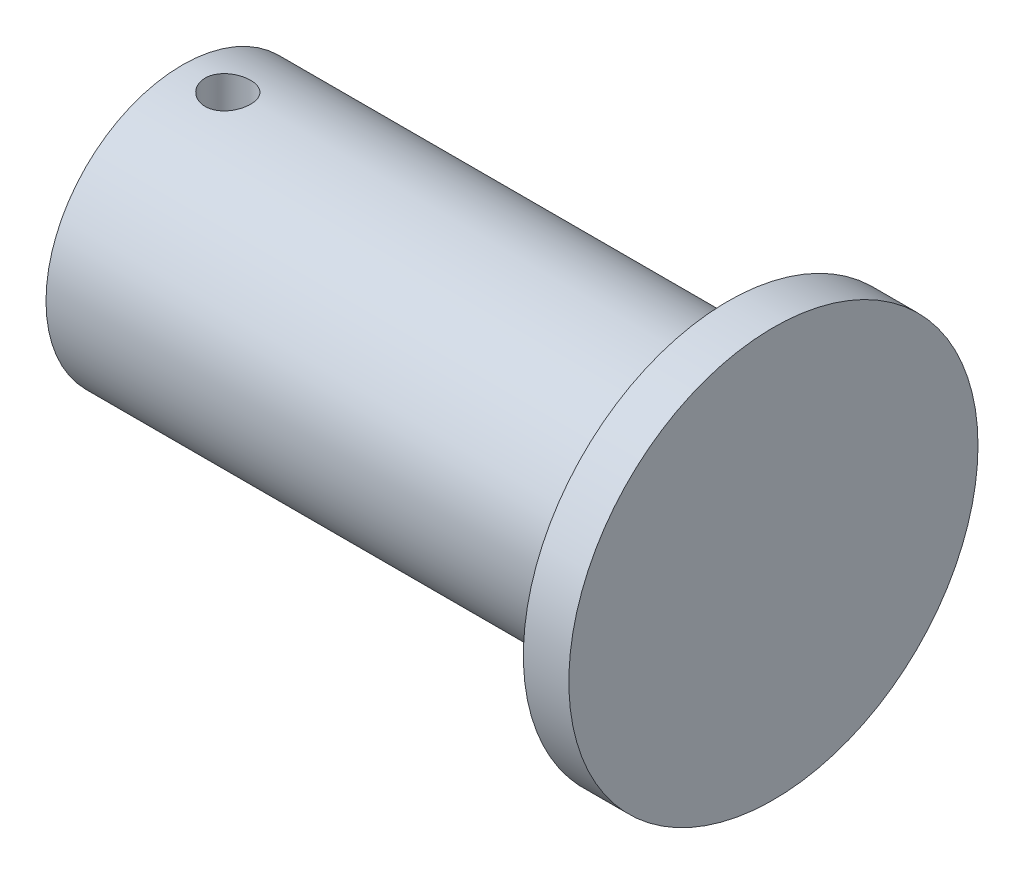
ISO-10303-21;
HEADER;
FILE_DESCRIPTION(('STEP AP214'),'2;1');
FILE_NAME('part.step','',(''),(''),'','','');
FILE_SCHEMA(('AUTOMOTIVE_DESIGN { 1 0 10303 214 1 1 1 1 }'));
ENDSEC;
DATA;
#1=APPLICATION_CONTEXT('core data for automotive mechanical design processes');
#2=APPLICATION_PROTOCOL_DEFINITION('international standard','automotive_design',2000,#1);
#3=PRODUCT_CONTEXT('',#1,'mechanical');
#4=PRODUCT('Part','Part','',(#3));
#5=PRODUCT_RELATED_PRODUCT_CATEGORY('part','',(#4));
#6=PRODUCT_DEFINITION_FORMATION('','',#4);
#7=PRODUCT_DEFINITION_CONTEXT('part definition',#1,'design');
#8=PRODUCT_DEFINITION('design','',#6,#7);
#9=PRODUCT_DEFINITION_SHAPE('','',#8);
#10=(LENGTH_UNIT() NAMED_UNIT(*) SI_UNIT(.MILLI.,.METRE.));
#11=(NAMED_UNIT(*) PLANE_ANGLE_UNIT() SI_UNIT($,.RADIAN.));
#12=(NAMED_UNIT(*) SI_UNIT($,.STERADIAN.) SOLID_ANGLE_UNIT());
#13=UNCERTAINTY_MEASURE_WITH_UNIT(LENGTH_MEASURE(1.E-05),#10,'distance_accuracy_value','');
#14=(GEOMETRIC_REPRESENTATION_CONTEXT(3) GLOBAL_UNCERTAINTY_ASSIGNED_CONTEXT((#13)) GLOBAL_UNIT_ASSIGNED_CONTEXT((#10,
#11,#12)) REPRESENTATION_CONTEXT('',''));
#15=CARTESIAN_POINT('',(0.,0.,0.));
#16=DIRECTION('',(0.,0.,1.));
#17=DIRECTION('',(1.,0.,0.));
#18=AXIS2_PLACEMENT_3D('',#15,#16,#17);
#19=CARTESIAN_POINT('',(30.,0.,0.));
#20=DIRECTION('',(-1.,0.,0.));
#21=DIRECTION('',(0.,0.,1.));
#22=AXIS2_PLACEMENT_3D('',#19,#20,#21);
#23=CYLINDRICAL_SURFACE('',#22,15.);
#24=CARTESIAN_POINT('',(-25.,-14.790199457749,2.5));
#25=CARTESIAN_POINT('',(-24.8606242518382,-14.790201973666,2.49999439841982));
#26=CARTESIAN_POINT('',(-24.7211723939285,-14.7921909238524,2.48830516902828));
#27=CARTESIAN_POINT('',(-24.4461814567368,-14.7999245720004,2.44187742806637));
#28=CARTESIAN_POINT('',(-24.3106461062419,-14.8056727334637,2.40711766030861));
#29=CARTESIAN_POINT('',(-24.0475077166584,-14.8202560936731,2.31562954367049));
#30=CARTESIAN_POINT('',(-23.9198981513378,-14.8290887118401,2.25891955493198));
#31=CARTESIAN_POINT('',(-23.6760190452822,-14.8488427210228,2.12518649688947));
#32=CARTESIAN_POINT('',(-23.5597482304227,-14.8597638769423,2.04816571350133));
#33=CARTESIAN_POINT('',(-23.3406871502554,-14.8825847115588,1.87518752696654));
#34=CARTESIAN_POINT('',(-23.2380248686138,-14.8944921732795,1.77906904893234));
#35=CARTESIAN_POINT('',(-23.0502066931382,-14.9178748066858,1.57097200469527));
#36=CARTESIAN_POINT('',(-22.9650518368846,-14.9293499527174,1.45899249914997));
#37=CARTESIAN_POINT('',(-22.8141854327807,-14.9506573698271,1.22152286994835));
#38=CARTESIAN_POINT('',(-22.7485929922682,-14.9604794243234,1.09595608145671));
#39=CARTESIAN_POINT('',(-22.6394789294694,-14.9772873695709,0.835395621723866));
#40=CARTESIAN_POINT('',(-22.5959558721151,-14.9842734447266,0.700402564078186));
#41=CARTESIAN_POINT('',(-22.5326074650161,-14.994567347244,0.42614372634424));
#42=CARTESIAN_POINT('',(-22.5125670839953,-14.9979085311091,0.286928886679269));
#43=CARTESIAN_POINT('',(-22.4960842458474,-15.0006507934278,0.0070752855257956));
#44=CARTESIAN_POINT('',(-22.4996401847528,-15.0000521396931,-0.1335633785289));
#45=CARTESIAN_POINT('',(-22.5300813515282,-14.9950085843139,-0.410802185078877));
#46=CARTESIAN_POINT('',(-22.5567351634092,-14.990601836924,-0.547428530700142));
#47=CARTESIAN_POINT('',(-22.6322510742465,-14.9784797877164,-0.814241979611792));
#48=CARTESIAN_POINT('',(-22.6811138495895,-14.9707643851321,-0.944428886651504));
#49=CARTESIAN_POINT('',(-22.7998906403153,-14.9528269851196,-1.19535614778265));
#50=CARTESIAN_POINT('',(-22.8699000120824,-14.9425936732688,-1.31605052301904));
#51=CARTESIAN_POINT('',(-23.028912822635,-14.920757380715,-1.54406552984664));
#52=CARTESIAN_POINT('',(-23.1179177987108,-14.9091542891913,-1.65138507791588));
#53=CARTESIAN_POINT('',(-23.3136788066193,-14.885702682326,-1.85097127344667));
#54=CARTESIAN_POINT('',(-23.420637094901,-14.8738528973104,-1.94303950225321));
#55=CARTESIAN_POINT('',(-23.6485870902158,-14.8513795978481,-2.10795458844806));
#56=CARTESIAN_POINT('',(-23.7695789266828,-14.8407560947132,-2.18080126853242));
#57=CARTESIAN_POINT('',(-24.0223916418775,-14.8219375456182,-2.30524443448828));
#58=CARTESIAN_POINT('',(-24.1542244980921,-14.813745233026,-2.35681702727924));
#59=CARTESIAN_POINT('',(-24.4248490723075,-14.8007618868988,-2.43702987081562));
#60=CARTESIAN_POINT('',(-24.5636401764324,-14.7959705538832,-2.46567214076795));
#61=CARTESIAN_POINT('',(-24.8424661561621,-14.7903895942212,-2.49893188487927));
#62=CARTESIAN_POINT('',(-24.9824663797021,-14.7895528575867,-2.50383220791244));
#63=CARTESIAN_POINT('',(-25.2612866716908,-14.7918503478236,-2.49022270268246));
#64=CARTESIAN_POINT('',(-25.400106785514,-14.7949844213185,-2.47171377862466));
#65=CARTESIAN_POINT('',(-25.6717277591909,-14.8048268745502,-2.4120523349281));
#66=CARTESIAN_POINT('',(-25.804561139878,-14.8115125191835,-2.37104379064638));
#67=CARTESIAN_POINT('',(-26.0614701662795,-14.827685730055,-2.26769819019227));
#68=CARTESIAN_POINT('',(-26.1855452875509,-14.8371734639058,-2.20535985810093));
#69=CARTESIAN_POINT('',(-26.4226745944061,-14.8579912839739,-2.06045667322923));
#70=CARTESIAN_POINT('',(-26.5356165727561,-14.8693375560035,-1.97771056415936));
#71=CARTESIAN_POINT('',(-26.746113532695,-14.8925466667987,-1.79458946570798));
#72=CARTESIAN_POINT('',(-26.8436674311097,-14.9044095418533,-1.69421323638404));
#73=CARTESIAN_POINT('',(-27.0216518927287,-14.9274642211826,-1.47742807032881));
#74=CARTESIAN_POINT('',(-27.1018938262845,-14.9386477634467,-1.3608632533862));
#75=CARTESIAN_POINT('',(-27.2416553270049,-14.9589511243294,-1.11574344794933));
#76=CARTESIAN_POINT('',(-27.3011755644739,-14.9680710096998,-0.987188847470625));
#77=CARTESIAN_POINT('',(-27.3975105839549,-14.9831835816958,-0.722299051501326));
#78=CARTESIAN_POINT('',(-27.4344240757349,-14.9891898456762,-0.586000562602609));
#79=CARTESIAN_POINT('',(-27.4848155989638,-14.9974558316928,-0.309030734874209));
#80=CARTESIAN_POINT('',(-27.4982955587323,-14.9997158620019,-0.168359756821619));
#81=CARTESIAN_POINT('',(-27.5013818823122,-15.0002303788781,0.111541275773678));
#82=CARTESIAN_POINT('',(-27.4912752539411,-14.9985330202419,0.250768160602666));
#83=CARTESIAN_POINT('',(-27.4480960777306,-14.9914217838733,0.525511974314706));
#84=CARTESIAN_POINT('',(-27.4150236584903,-14.9860079269518,0.66102892396748));
#85=CARTESIAN_POINT('',(-27.3269618344563,-14.972069888274,0.924396445918538));
#86=CARTESIAN_POINT('',(-27.2719968317899,-14.9635491704088,1.05225537215382));
#87=CARTESIAN_POINT('',(-27.1417420637694,-14.9443275687803,1.29698045298217));
#88=CARTESIAN_POINT('',(-27.0664513349375,-14.9336265816741,1.41384608611822));
#89=CARTESIAN_POINT('',(-26.8966649075395,-14.9110762961641,1.63471294552639));
#90=CARTESIAN_POINT('',(-26.8019590452487,-14.8992152454112,1.73855143060274));
#91=CARTESIAN_POINT('',(-26.5964716920962,-14.8757630331437,1.92896387595091));
#92=CARTESIAN_POINT('',(-26.4856864410875,-14.8641719354951,2.0155337867119));
#93=CARTESIAN_POINT('',(-26.2502546775104,-14.8424834353391,2.16951427091086));
#94=CARTESIAN_POINT('',(-26.1255156602345,-14.8323971784578,2.2367849890577));
#95=CARTESIAN_POINT('',(-25.8663907641618,-14.8149921009131,2.34931453640427));
#96=CARTESIAN_POINT('',(-25.7320146773226,-14.8076705172488,2.39459535522307));
#97=CARTESIAN_POINT('',(-25.4975962305126,-14.7982474485649,2.45202605312742));
#98=CARTESIAN_POINT('',(-25.3989731920374,-14.7952462341947,2.46998741767139));
#99=CARTESIAN_POINT('',(-25.2002465151631,-14.7912213528807,2.49397629518131));
#100=CARTESIAN_POINT('',(-25.1001429036758,-14.7901976500369,2.50000402479277));
#101=CARTESIAN_POINT('',(-25.,-14.790199457749,2.5));
#102=B_SPLINE_CURVE_WITH_KNOTS('',3,(#24,#25,#26,#27,#28,#29,#30,#31,#32,#33,#34,#35,#36,#37,
#38,#39,#40,#41,#42,#43,#44,#45,#46,#47,#48,#49,#50,#51,#52,#53,#54,#55,#56,#57,#58,#59,#60,#61,
#62,#63,#64,#65,#66,#67,#68,#69,#70,#71,#72,#73,#74,#75,#76,#77,#78,#79,#80,#81,#82,#83,#84,#85,
#86,#87,#88,#89,#90,#91,#92,#93,#94,#95,#96,#97,#98,#99,#100,#101),.UNSPECIFIED.,.T.,.F.,(4,2,2,
2,2,2,2,2,2,2,2,2,2,2,2,2,2,2,2,2,2,2,2,2,2,2,2,2,2,2,2,2,2,2,2,2,2,2,4),(0.,0.417761038927743,
0.83590751996297,1.25370499787518,1.67145547405274,2.09289159155715,2.51435267834447,
2.93832980111435,3.36227935111113,3.78231567472565,4.20232344652692,4.61817121164668,
5.03403164249533,5.45179604139425,5.86959426226764,6.29246123462123,6.71533210746018,
7.13867662498603,7.56198385938076,7.9802354242041,8.39847083413976,8.81406064635491,
9.22967532293574,9.64912342762701,10.0686010443069,10.4924411303538,10.916267504767,
11.3382298441765,11.7601574591235,12.1769777626592,12.5937957321882,13.0101503983246,
13.4265248039233,13.8476699746325,14.2689137888181,14.6931372761832,15.1169356674445,
15.4171067054376,15.7172722940182),.UNSPECIFIED.);
#103=CARTESIAN_POINT('',(-25.,-14.790199457749,2.5));
#104=VERTEX_POINT('',#103);
#105=EDGE_CURVE('E35',#104,#104,#102,.T.);
#106=ORIENTED_EDGE('',*,*,#105,.T.);
#107=EDGE_LOOP('',(#106));
#108=FACE_BOUND('',#107,.T.);
#109=CARTESIAN_POINT('',(-25.,14.790199457749,2.5));
#110=CARTESIAN_POINT('',(-25.1393757481618,14.790201973666,2.49999439841982));
#111=CARTESIAN_POINT('',(-25.2788276060715,14.7921909238523,2.48830516902828));
#112=CARTESIAN_POINT('',(-25.5538185432632,14.7999245720004,2.44187742806637));
#113=CARTESIAN_POINT('',(-25.6893538937581,14.8056727334637,2.40711766030861));
#114=CARTESIAN_POINT('',(-25.9524922833416,14.8202560936731,2.31562954367049));
#115=CARTESIAN_POINT('',(-26.0801018486622,14.8290887118401,2.25891955493199));
#116=CARTESIAN_POINT('',(-26.3239809547178,14.8488427210228,2.12518649688947));
#117=CARTESIAN_POINT('',(-26.4402517695773,14.8597638769423,2.04816571350133));
#118=CARTESIAN_POINT('',(-26.6593128497446,14.8825847115588,1.87518752696654));
#119=CARTESIAN_POINT('',(-26.7619751313862,14.8944921732795,1.77906904893234));
#120=CARTESIAN_POINT('',(-26.9497933068618,14.9178748066858,1.57097200469527));
#121=CARTESIAN_POINT('',(-27.0349481631154,14.9293499527174,1.45899249914997));
#122=CARTESIAN_POINT('',(-27.1858145672193,14.9506573698271,1.22152286994836));
#123=CARTESIAN_POINT('',(-27.2514070077318,14.9604794243234,1.09595608145671));
#124=CARTESIAN_POINT('',(-27.3605210705305,14.9772873695709,0.835395621723868));
#125=CARTESIAN_POINT('',(-27.4040441278849,14.9842734447266,0.700402564078187));
#126=CARTESIAN_POINT('',(-27.4673925349839,14.994567347244,0.426143726344241));
#127=CARTESIAN_POINT('',(-27.4874329160047,14.9979085311091,0.28692888667927));
#128=CARTESIAN_POINT('',(-27.5039157541526,15.0006507934278,0.00707528552579642));
#129=CARTESIAN_POINT('',(-27.5003598152472,15.0000521396931,-0.133563378528899));
#130=CARTESIAN_POINT('',(-27.4699186484718,14.9950085843139,-0.410802185078876));
#131=CARTESIAN_POINT('',(-27.4432648365908,14.990601836924,-0.547428530700141));
#132=CARTESIAN_POINT('',(-27.3677489257535,14.9784797877164,-0.814241979611792));
#133=CARTESIAN_POINT('',(-27.3188861504105,14.9707643851321,-0.944428886651505));
#134=CARTESIAN_POINT('',(-27.2001093596847,14.9528269851196,-1.19535614778265));
#135=CARTESIAN_POINT('',(-27.1300999879176,14.9425936732688,-1.31605052301905));
#136=CARTESIAN_POINT('',(-26.9710871773649,14.920757380715,-1.54406552984664));
#137=CARTESIAN_POINT('',(-26.8820822012892,14.9091542891913,-1.65138507791588));
#138=CARTESIAN_POINT('',(-26.6863211933807,14.885702682326,-1.85097127344667));
#139=CARTESIAN_POINT('',(-26.579362905099,14.8738528973104,-1.94303950225321));
#140=CARTESIAN_POINT('',(-26.3514129097842,14.8513795978481,-2.10795458844806));
#141=CARTESIAN_POINT('',(-26.2304210733172,14.8407560947132,-2.18080126853242));
#142=CARTESIAN_POINT('',(-25.9776083581225,14.8219375456182,-2.30524443448829));
#143=CARTESIAN_POINT('',(-25.8457755019079,14.813745233026,-2.35681702727924));
#144=CARTESIAN_POINT('',(-25.5751509276924,14.8007618868988,-2.43702987081562));
#145=CARTESIAN_POINT('',(-25.4363598235676,14.7959705538832,-2.46567214076795));
#146=CARTESIAN_POINT('',(-25.1575338438379,14.7903895942212,-2.49893188487927));
#147=CARTESIAN_POINT('',(-25.0175336202979,14.7895528575867,-2.50383220791244));
#148=CARTESIAN_POINT('',(-24.7387133283092,14.7918503478236,-2.49022270268246));
#149=CARTESIAN_POINT('',(-24.599893214486,14.7949844213185,-2.47171377862466));
#150=CARTESIAN_POINT('',(-24.3282722408091,14.8048268745502,-2.4120523349281));
#151=CARTESIAN_POINT('',(-24.195438860122,14.8115125191835,-2.37104379064638));
#152=CARTESIAN_POINT('',(-23.9385298337205,14.827685730055,-2.26769819019228));
#153=CARTESIAN_POINT('',(-23.8144547124491,14.8371734639058,-2.20535985810093));
#154=CARTESIAN_POINT('',(-23.5773254055939,14.8579912839739,-2.06045667322923));
#155=CARTESIAN_POINT('',(-23.4643834272439,14.8693375560035,-1.97771056415936));
#156=CARTESIAN_POINT('',(-23.253886467305,14.8925466667987,-1.79458946570798));
#157=CARTESIAN_POINT('',(-23.1563325688903,14.9044095418533,-1.69421323638404));
#158=CARTESIAN_POINT('',(-22.9783481072713,14.9274642211826,-1.47742807032881));
#159=CARTESIAN_POINT('',(-22.8981061737155,14.9386477634467,-1.3608632533862));
#160=CARTESIAN_POINT('',(-22.7583446729951,14.9589511243294,-1.11574344794933));
#161=CARTESIAN_POINT('',(-22.6988244355261,14.9680710096998,-0.987188847470627));
#162=CARTESIAN_POINT('',(-22.6024894160451,14.9831835816958,-0.722299051501329));
#163=CARTESIAN_POINT('',(-22.5655759242651,14.9891898456762,-0.586000562602613));
#164=CARTESIAN_POINT('',(-22.5151844010362,14.9974558316928,-0.309030734874212));
#165=CARTESIAN_POINT('',(-22.5017044412676,14.9997158620019,-0.168359756821621));
#166=CARTESIAN_POINT('',(-22.4986181176878,15.0002303788781,0.111541275773676));
#167=CARTESIAN_POINT('',(-22.5087247460589,14.9985330202419,0.250768160602664));
#168=CARTESIAN_POINT('',(-22.5519039222694,14.9914217838733,0.525511974314705));
#169=CARTESIAN_POINT('',(-22.5849763415097,14.9860079269518,0.661028923967479));
#170=CARTESIAN_POINT('',(-22.6730381655436,14.972069888274,0.924396445918538));
#171=CARTESIAN_POINT('',(-22.72800316821,14.9635491704088,1.05225537215382));
#172=CARTESIAN_POINT('',(-22.8582579362306,14.9443275687803,1.29698045298217));
#173=CARTESIAN_POINT('',(-22.9335486650624,14.9336265816741,1.41384608611822));
#174=CARTESIAN_POINT('',(-23.1033350924605,14.9110762961641,1.6347129455264));
#175=CARTESIAN_POINT('',(-23.1980409547513,14.8992152454112,1.73855143060275));
#176=CARTESIAN_POINT('',(-23.4035283079038,14.8757630331437,1.92896387595091));
#177=CARTESIAN_POINT('',(-23.5143135589125,14.8641719354951,2.0155337867119));
#178=CARTESIAN_POINT('',(-23.7497453224896,14.8424834353391,2.16951427091086));
#179=CARTESIAN_POINT('',(-23.8744843397655,14.8323971784578,2.2367849890577));
#180=CARTESIAN_POINT('',(-24.1336092358381,14.8149921009131,2.34931453640427));
#181=CARTESIAN_POINT('',(-24.2679853226774,14.8076705172488,2.39459535522307));
#182=CARTESIAN_POINT('',(-24.5024037694874,14.7982474485649,2.45202605312742));
#183=CARTESIAN_POINT('',(-24.6010268079626,14.7952462341947,2.46998741767139));
#184=CARTESIAN_POINT('',(-24.7997534848369,14.7912213528807,2.49397629518131));
#185=CARTESIAN_POINT('',(-24.8998570963242,14.7901976500369,2.50000402479277));
#186=CARTESIAN_POINT('',(-25.,14.790199457749,2.5));
#187=B_SPLINE_CURVE_WITH_KNOTS('',3,(#109,#110,#111,#112,#113,#114,#115,#116,#117,#118,#119,
#120,#121,#122,#123,#124,#125,#126,#127,#128,#129,#130,#131,#132,#133,#134,#135,#136,#137,#138,
#139,#140,#141,#142,#143,#144,#145,#146,#147,#148,#149,#150,#151,#152,#153,#154,#155,#156,#157,
#158,#159,#160,#161,#162,#163,#164,#165,#166,#167,#168,#169,#170,#171,#172,#173,#174,#175,#176,
#177,#178,#179,#180,#181,#182,#183,#184,#185,#186),.UNSPECIFIED.,.T.,.F.,(4,2,2,2,2,2,2,2,2,2,2,
2,2,2,2,2,2,2,2,2,2,2,2,2,2,2,2,2,2,2,2,2,2,2,2,2,2,2,4),(0.,0.417761038927747,0.83590751996297,
1.25370499787518,1.67145547405274,2.09289159155715,2.51435267834447,2.93832980111435,
3.36227935111113,3.78231567472565,4.20232344652692,4.61817121164668,5.03403164249533,
5.45179604139425,5.86959426226764,6.29246123462123,6.71533210746019,7.13867662498604,
7.56198385938077,7.98023542420411,8.39847083413976,8.81406064635491,9.22967532293574,
9.64912342762701,10.0686010443069,10.4924411303538,10.916267504767,11.3382298441765,
11.7601574591235,12.1769777626592,12.5937957321882,13.0101503983246,13.4265248039233,
13.8476699746325,14.2689137888181,14.6931372761832,15.1169356674445,15.4171067054376,
15.7172722940182),.UNSPECIFIED.);
#188=CARTESIAN_POINT('',(-25.,14.790199457749,2.5));
#189=VERTEX_POINT('',#188);
#190=EDGE_CURVE('E53',#189,#189,#187,.T.);
#191=ORIENTED_EDGE('',*,*,#190,.T.);
#192=EDGE_LOOP('',(#191));
#193=FACE_BOUND('',#192,.T.);
#194=CARTESIAN_POINT('',(30.,0.,0.));
#195=DIRECTION('',(1.,0.,0.));
#196=DIRECTION('',(0.,0.,-1.));
#197=AXIS2_PLACEMENT_3D('',#194,#195,#196);
#198=CIRCLE('',#197,15.);
#199=CARTESIAN_POINT('',(30.,0.,-15.));
#200=VERTEX_POINT('',#199);
#201=EDGE_CURVE('E10',#200,#200,#198,.T.);
#202=ORIENTED_EDGE('',*,*,#201,.F.);
#203=EDGE_LOOP('',(#202));
#204=FACE_BOUND('',#203,.T.);
#205=CARTESIAN_POINT('',(-30.,0.,0.));
#206=DIRECTION('',(1.,0.,0.));
#207=DIRECTION('',(0.,0.,-1.));
#208=AXIS2_PLACEMENT_3D('',#205,#206,#207);
#209=CIRCLE('',#208,15.);
#210=CARTESIAN_POINT('',(-30.,0.,-15.));
#211=VERTEX_POINT('',#210);
#212=EDGE_CURVE('E43',#211,#211,#209,.T.);
#213=ORIENTED_EDGE('',*,*,#212,.T.);
#214=EDGE_LOOP('',(#213));
#215=FACE_BOUND('',#214,.T.);
#216=ADVANCED_FACE('F31',(#108,#193,#204,#215),#23,.T.);
#217=CARTESIAN_POINT('',(-30.,0.,0.));
#218=DIRECTION('',(1.,0.,0.));
#219=DIRECTION('',(0.,0.,-1.));
#220=AXIS2_PLACEMENT_3D('',#217,#218,#219);
#221=PLANE('',#220);
#222=ORIENTED_EDGE('',*,*,#212,.F.);
#223=EDGE_LOOP('',(#222));
#224=FACE_BOUND('',#223,.T.);
#225=ADVANCED_FACE('F73',(#224),#221,.F.);
#226=CARTESIAN_POINT('',(35.,0.,0.));
#227=DIRECTION('',(-1.,0.,0.));
#228=DIRECTION('',(0.,0.,1.));
#229=AXIS2_PLACEMENT_3D('',#226,#227,#228);
#230=CYLINDRICAL_SURFACE('',#229,22.5);
#231=CARTESIAN_POINT('',(35.,0.,0.));
#232=DIRECTION('',(1.,0.,0.));
#233=DIRECTION('',(0.,0.,-1.));
#234=AXIS2_PLACEMENT_3D('',#231,#232,#233);
#235=CIRCLE('',#234,22.5);
#236=CARTESIAN_POINT('',(35.,0.,-22.5));
#237=VERTEX_POINT('',#236);
#238=EDGE_CURVE('E48',#237,#237,#235,.T.);
#239=ORIENTED_EDGE('',*,*,#238,.F.);
#240=EDGE_LOOP('',(#239));
#241=FACE_BOUND('',#240,.T.);
#242=CARTESIAN_POINT('',(30.,0.,0.));
#243=DIRECTION('',(1.,0.,0.));
#244=DIRECTION('',(0.,0.,-1.));
#245=AXIS2_PLACEMENT_3D('',#242,#243,#244);
#246=CIRCLE('',#245,22.5);
#247=CARTESIAN_POINT('',(30.,0.,-22.5));
#248=VERTEX_POINT('',#247);
#249=EDGE_CURVE('E51',#248,#248,#246,.T.);
#250=ORIENTED_EDGE('',*,*,#249,.T.);
#251=EDGE_LOOP('',(#250));
#252=FACE_BOUND('',#251,.T.);
#253=ADVANCED_FACE('F68',(#241,#252),#230,.T.);
#254=CARTESIAN_POINT('',(35.,0.,0.));
#255=DIRECTION('',(1.,0.,0.));
#256=DIRECTION('',(0.,0.,-1.));
#257=AXIS2_PLACEMENT_3D('',#254,#255,#256);
#258=PLANE('',#257);
#259=ORIENTED_EDGE('',*,*,#238,.T.);
#260=EDGE_LOOP('',(#259));
#261=FACE_BOUND('',#260,.T.);
#262=ADVANCED_FACE('F64',(#261),#258,.T.);
#263=CARTESIAN_POINT('',(30.,0.,0.));
#264=DIRECTION('',(1.,0.,0.));
#265=DIRECTION('',(0.,0.,-1.));
#266=AXIS2_PLACEMENT_3D('',#263,#264,#265);
#267=PLANE('',#266);
#268=ORIENTED_EDGE('',*,*,#201,.T.);
#269=EDGE_LOOP('',(#268));
#270=FACE_BOUND('',#269,.T.);
#271=ORIENTED_EDGE('',*,*,#249,.F.);
#272=EDGE_LOOP('',(#271));
#273=FACE_BOUND('',#272,.T.);
#274=ADVANCED_FACE('F62',(#270,#273),#267,.F.);
#275=CARTESIAN_POINT('',(-25.,-22.5,0.));
#276=DIRECTION('',(0.,1.,0.));
#277=DIRECTION('',(0.,0.,1.));
#278=AXIS2_PLACEMENT_3D('',#275,#276,#277);
#279=CYLINDRICAL_SURFACE('',#278,2.5);
#280=ORIENTED_EDGE('',*,*,#190,.F.);
#281=EDGE_LOOP('',(#280));
#282=FACE_BOUND('',#281,.T.);
#283=ORIENTED_EDGE('',*,*,#105,.F.);
#284=EDGE_LOOP('',(#283));
#285=FACE_BOUND('',#284,.T.);
#286=ADVANCED_FACE('F58',(#282,#285),#279,.F.);
#287=CLOSED_SHELL('',(#216,#225,#253,#262,#274,#286));
#288=MANIFOLD_SOLID_BREP('B2',#287);
#289=ADVANCED_BREP_SHAPE_REPRESENTATION('',(#18,#288),#14);
#290=SHAPE_DEFINITION_REPRESENTATION(#9,#289);
ENDSEC;
END-ISO-10303-21;
